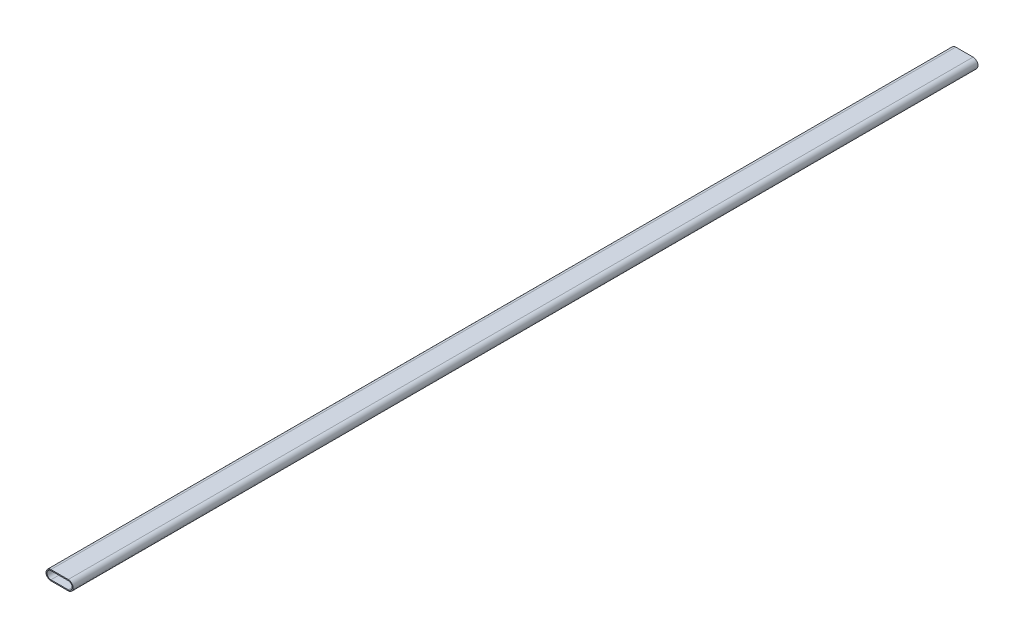
ISO-10303-21;
HEADER;
FILE_DESCRIPTION(('STEP AP214'),'2;1');
FILE_NAME('part.step','',(''),(''),'','','');
FILE_SCHEMA(('AUTOMOTIVE_DESIGN { 1 0 10303 214 1 1 1 1 }'));
ENDSEC;
DATA;
#1=APPLICATION_CONTEXT('core data for automotive mechanical design processes');
#2=APPLICATION_PROTOCOL_DEFINITION('international standard','automotive_design',2000,#1);
#3=PRODUCT_CONTEXT('',#1,'mechanical');
#4=PRODUCT('Part','Part','',(#3));
#5=PRODUCT_RELATED_PRODUCT_CATEGORY('part','',(#4));
#6=PRODUCT_DEFINITION_FORMATION('','',#4);
#7=PRODUCT_DEFINITION_CONTEXT('part definition',#1,'design');
#8=PRODUCT_DEFINITION('design','',#6,#7);
#9=PRODUCT_DEFINITION_SHAPE('','',#8);
#10=(LENGTH_UNIT() NAMED_UNIT(*) SI_UNIT(.MILLI.,.METRE.));
#11=(NAMED_UNIT(*) PLANE_ANGLE_UNIT() SI_UNIT($,.RADIAN.));
#12=(NAMED_UNIT(*) SI_UNIT($,.STERADIAN.) SOLID_ANGLE_UNIT());
#13=UNCERTAINTY_MEASURE_WITH_UNIT(LENGTH_MEASURE(1.E-05),#10,'distance_accuracy_value','');
#14=(GEOMETRIC_REPRESENTATION_CONTEXT(3) GLOBAL_UNCERTAINTY_ASSIGNED_CONTEXT((#13)) GLOBAL_UNIT_ASSIGNED_CONTEXT((#10,
#11,#12)) REPRESENTATION_CONTEXT('',''));
#15=CARTESIAN_POINT('',(0.,0.,0.));
#16=DIRECTION('',(0.,0.,1.));
#17=DIRECTION('',(1.,0.,0.));
#18=AXIS2_PLACEMENT_3D('',#15,#16,#17);
#19=CARTESIAN_POINT('',(0.,0.,1100.));
#20=DIRECTION('',(0.,0.,1.));
#21=DIRECTION('',(1.,0.,0.));
#22=AXIS2_PLACEMENT_3D('',#19,#20,#21);
#23=PLANE('',#22);
#24=CARTESIAN_POINT('',(0.,0.,1100.));
#25=DIRECTION('',(0.,0.,1.));
#26=DIRECTION('',(1.,0.,0.));
#27=AXIS2_PLACEMENT_3D('',#24,#25,#26);
#28=CIRCLE('',#27,6.);
#29=CARTESIAN_POINT('',(0.,6.,1100.));
#30=VERTEX_POINT('',#29);
#31=CARTESIAN_POINT('',(0.,-6.,1100.));
#32=VERTEX_POINT('',#31);
#33=EDGE_CURVE('E133',#30,#32,#28,.T.);
#34=ORIENTED_EDGE('',*,*,#33,.T.);
#35=DIRECTION('',(1.,0.,0.));
#36=VECTOR('',#35,1.);
#37=CARTESIAN_POINT('',(0.,-6.,1100.));
#38=LINE('',#37,#36);
#39=CARTESIAN_POINT('',(21.,-6.,1100.));
#40=VERTEX_POINT('',#39);
#41=EDGE_CURVE('E136',#32,#40,#38,.T.);
#42=ORIENTED_EDGE('',*,*,#41,.T.);
#43=CARTESIAN_POINT('',(21.,0.,1100.));
#44=DIRECTION('',(0.,0.,1.));
#45=DIRECTION('',(1.,0.,0.));
#46=AXIS2_PLACEMENT_3D('',#43,#44,#45);
#47=CIRCLE('',#46,6.);
#48=CARTESIAN_POINT('',(21.,6.,1100.));
#49=VERTEX_POINT('',#48);
#50=EDGE_CURVE('E139',#40,#49,#47,.T.);
#51=ORIENTED_EDGE('',*,*,#50,.T.);
#52=DIRECTION('',(-1.,0.,0.));
#53=VECTOR('',#52,1.);
#54=CARTESIAN_POINT('',(0.,6.,1100.));
#55=LINE('',#54,#53);
#56=EDGE_CURVE('E141',#49,#30,#55,.T.);
#57=ORIENTED_EDGE('',*,*,#56,.T.);
#58=EDGE_LOOP('',(#34,#42,#51,#57));
#59=FACE_BOUND('',#58,.T.);
#60=DIRECTION('',(1.,0.,0.));
#61=VECTOR('',#60,1.);
#62=CARTESIAN_POINT('',(0.,-4.8,1100.));
#63=LINE('',#62,#61);
#64=CARTESIAN_POINT('',(0.,-4.8,1100.));
#65=VERTEX_POINT('',#64);
#66=CARTESIAN_POINT('',(21.,-4.8,1100.));
#67=VERTEX_POINT('',#66);
#68=EDGE_CURVE('E105',#65,#67,#63,.T.);
#69=ORIENTED_EDGE('',*,*,#68,.F.);
#70=CARTESIAN_POINT('',(0.,0.,1100.));
#71=DIRECTION('',(0.,0.,1.));
#72=DIRECTION('',(1.,0.,0.));
#73=AXIS2_PLACEMENT_3D('',#70,#71,#72);
#74=CIRCLE('',#73,4.8);
#75=CARTESIAN_POINT('',(0.,4.8,1100.));
#76=VERTEX_POINT('',#75);
#77=EDGE_CURVE('E97',#76,#65,#74,.T.);
#78=ORIENTED_EDGE('',*,*,#77,.F.);
#79=DIRECTION('',(-1.,0.,0.));
#80=VECTOR('',#79,1.);
#81=CARTESIAN_POINT('',(0.,4.8,1100.));
#82=LINE('',#81,#80);
#83=CARTESIAN_POINT('',(21.,4.8,1100.));
#84=VERTEX_POINT('',#83);
#85=EDGE_CURVE('E119',#84,#76,#82,.T.);
#86=ORIENTED_EDGE('',*,*,#85,.F.);
#87=CARTESIAN_POINT('',(21.,0.,1100.));
#88=DIRECTION('',(0.,0.,1.));
#89=DIRECTION('',(1.,0.,0.));
#90=AXIS2_PLACEMENT_3D('',#87,#88,#89);
#91=CIRCLE('',#90,4.8);
#92=EDGE_CURVE('E117',#67,#84,#91,.T.);
#93=ORIENTED_EDGE('',*,*,#92,.F.);
#94=EDGE_LOOP('',(#69,#78,#86,#93));
#95=FACE_BOUND('',#94,.T.);
#96=ADVANCED_FACE('F32',(#59,#95),#23,.T.);
#97=CARTESIAN_POINT('',(0.,0.,0.));
#98=DIRECTION('',(0.,0.,1.));
#99=DIRECTION('',(1.,0.,0.));
#100=AXIS2_PLACEMENT_3D('',#97,#98,#99);
#101=PLANE('',#100);
#102=CARTESIAN_POINT('',(0.,0.,0.));
#103=DIRECTION('',(0.,0.,1.));
#104=DIRECTION('',(1.,0.,0.));
#105=AXIS2_PLACEMENT_3D('',#102,#103,#104);
#106=CIRCLE('',#105,6.);
#107=CARTESIAN_POINT('',(0.,6.,0.));
#108=VERTEX_POINT('',#107);
#109=CARTESIAN_POINT('',(0.,-6.,0.));
#110=VERTEX_POINT('',#109);
#111=EDGE_CURVE('E113',#108,#110,#106,.T.);
#112=ORIENTED_EDGE('',*,*,#111,.F.);
#113=DIRECTION('',(-1.,0.,0.));
#114=VECTOR('',#113,1.);
#115=CARTESIAN_POINT('',(0.,6.,0.));
#116=LINE('',#115,#114);
#117=CARTESIAN_POINT('',(21.,6.,0.));
#118=VERTEX_POINT('',#117);
#119=EDGE_CURVE('E137',#118,#108,#116,.T.);
#120=ORIENTED_EDGE('',*,*,#119,.F.);
#121=CARTESIAN_POINT('',(21.,0.,0.));
#122=DIRECTION('',(0.,0.,1.));
#123=DIRECTION('',(1.,0.,0.));
#124=AXIS2_PLACEMENT_3D('',#121,#122,#123);
#125=CIRCLE('',#124,6.);
#126=CARTESIAN_POINT('',(21.,-6.,0.));
#127=VERTEX_POINT('',#126);
#128=EDGE_CURVE('E148',#127,#118,#125,.T.);
#129=ORIENTED_EDGE('',*,*,#128,.F.);
#130=DIRECTION('',(1.,0.,0.));
#131=VECTOR('',#130,1.);
#132=CARTESIAN_POINT('',(0.,-6.,0.));
#133=LINE('',#132,#131);
#134=EDGE_CURVE('E146',#110,#127,#133,.T.);
#135=ORIENTED_EDGE('',*,*,#134,.F.);
#136=EDGE_LOOP('',(#112,#120,#129,#135));
#137=FACE_BOUND('',#136,.T.);
#138=CARTESIAN_POINT('',(0.,0.,0.));
#139=DIRECTION('',(0.,0.,1.));
#140=DIRECTION('',(1.,0.,0.));
#141=AXIS2_PLACEMENT_3D('',#138,#139,#140);
#142=CIRCLE('',#141,4.8);
#143=CARTESIAN_POINT('',(0.,4.8,0.));
#144=VERTEX_POINT('',#143);
#145=CARTESIAN_POINT('',(0.,-4.8,0.));
#146=VERTEX_POINT('',#145);
#147=EDGE_CURVE('E55',#144,#146,#142,.T.);
#148=ORIENTED_EDGE('',*,*,#147,.T.);
#149=DIRECTION('',(1.,0.,0.));
#150=VECTOR('',#149,1.);
#151=CARTESIAN_POINT('',(0.,-4.8,0.));
#152=LINE('',#151,#150);
#153=CARTESIAN_POINT('',(21.,-4.8,0.));
#154=VERTEX_POINT('',#153);
#155=EDGE_CURVE('E112',#146,#154,#152,.T.);
#156=ORIENTED_EDGE('',*,*,#155,.T.);
#157=CARTESIAN_POINT('',(21.,0.,0.));
#158=DIRECTION('',(0.,0.,1.));
#159=DIRECTION('',(1.,0.,0.));
#160=AXIS2_PLACEMENT_3D('',#157,#158,#159);
#161=CIRCLE('',#160,4.8);
#162=CARTESIAN_POINT('',(21.,4.8,0.));
#163=VERTEX_POINT('',#162);
#164=EDGE_CURVE('E125',#154,#163,#161,.T.);
#165=ORIENTED_EDGE('',*,*,#164,.T.);
#166=DIRECTION('',(-1.,0.,0.));
#167=VECTOR('',#166,1.);
#168=CARTESIAN_POINT('',(0.,4.8,0.));
#169=LINE('',#168,#167);
#170=EDGE_CURVE('E106',#163,#144,#169,.T.);
#171=ORIENTED_EDGE('',*,*,#170,.T.);
#172=EDGE_LOOP('',(#148,#156,#165,#171));
#173=FACE_BOUND('',#172,.T.);
#174=ADVANCED_FACE('F166',(#137,#173),#101,.F.);
#175=CARTESIAN_POINT('',(0.,0.,1100.));
#176=DIRECTION('',(0.,0.,-1.));
#177=DIRECTION('',(-1.,0.,0.));
#178=AXIS2_PLACEMENT_3D('',#175,#176,#177);
#179=CYLINDRICAL_SURFACE('',#178,6.);
#180=ORIENTED_EDGE('',*,*,#111,.T.);
#181=DIRECTION('',(0.,0.,-1.));
#182=VECTOR('',#181,1.);
#183=CARTESIAN_POINT('',(0.,-6.,1100.));
#184=LINE('',#183,#182);
#185=EDGE_CURVE('E11',#32,#110,#184,.T.);
#186=ORIENTED_EDGE('',*,*,#185,.F.);
#187=ORIENTED_EDGE('',*,*,#33,.F.);
#188=DIRECTION('',(0.,0.,-1.));
#189=VECTOR('',#188,1.);
#190=CARTESIAN_POINT('',(0.,6.,1100.));
#191=LINE('',#190,#189);
#192=EDGE_CURVE('E143',#30,#108,#191,.T.);
#193=ORIENTED_EDGE('',*,*,#192,.T.);
#194=EDGE_LOOP('',(#180,#186,#187,#193));
#195=FACE_BOUND('',#194,.T.);
#196=ADVANCED_FACE('F34',(#195),#179,.T.);
#197=CARTESIAN_POINT('',(0.,-6.,1100.));
#198=DIRECTION('',(0.,1.,0.));
#199=DIRECTION('',(0.,0.,1.));
#200=AXIS2_PLACEMENT_3D('',#197,#198,#199);
#201=PLANE('',#200);
#202=ORIENTED_EDGE('',*,*,#134,.T.);
#203=DIRECTION('',(0.,0.,-1.));
#204=VECTOR('',#203,1.);
#205=CARTESIAN_POINT('',(21.,-6.,1100.));
#206=LINE('',#205,#204);
#207=EDGE_CURVE('E40',#40,#127,#206,.T.);
#208=ORIENTED_EDGE('',*,*,#207,.F.);
#209=ORIENTED_EDGE('',*,*,#41,.F.);
#210=ORIENTED_EDGE('',*,*,#185,.T.);
#211=EDGE_LOOP('',(#202,#208,#209,#210));
#212=FACE_BOUND('',#211,.T.);
#213=ADVANCED_FACE('F176',(#212),#201,.F.);
#214=CARTESIAN_POINT('',(21.,0.,1100.));
#215=DIRECTION('',(0.,0.,-1.));
#216=DIRECTION('',(-1.,0.,0.));
#217=AXIS2_PLACEMENT_3D('',#214,#215,#216);
#218=CYLINDRICAL_SURFACE('',#217,6.);
#219=ORIENTED_EDGE('',*,*,#128,.T.);
#220=DIRECTION('',(0.,0.,-1.));
#221=VECTOR('',#220,1.);
#222=CARTESIAN_POINT('',(21.,6.,1100.));
#223=LINE('',#222,#221);
#224=EDGE_CURVE('E153',#49,#118,#223,.T.);
#225=ORIENTED_EDGE('',*,*,#224,.F.);
#226=ORIENTED_EDGE('',*,*,#50,.F.);
#227=ORIENTED_EDGE('',*,*,#207,.T.);
#228=EDGE_LOOP('',(#219,#225,#226,#227));
#229=FACE_BOUND('',#228,.T.);
#230=ADVANCED_FACE('F160',(#229),#218,.T.);
#231=CARTESIAN_POINT('',(0.,6.,1100.));
#232=DIRECTION('',(0.,-1.,0.));
#233=DIRECTION('',(0.,0.,-1.));
#234=AXIS2_PLACEMENT_3D('',#231,#232,#233);
#235=PLANE('',#234);
#236=ORIENTED_EDGE('',*,*,#119,.T.);
#237=ORIENTED_EDGE('',*,*,#192,.F.);
#238=ORIENTED_EDGE('',*,*,#56,.F.);
#239=ORIENTED_EDGE('',*,*,#224,.T.);
#240=EDGE_LOOP('',(#236,#237,#238,#239));
#241=FACE_BOUND('',#240,.T.);
#242=ADVANCED_FACE('F170',(#241),#235,.F.);
#243=CARTESIAN_POINT('',(0.,0.,1100.));
#244=DIRECTION('',(0.,0.,-1.));
#245=DIRECTION('',(-1.,0.,0.));
#246=AXIS2_PLACEMENT_3D('',#243,#244,#245);
#247=CYLINDRICAL_SURFACE('',#246,4.8);
#248=ORIENTED_EDGE('',*,*,#147,.F.);
#249=DIRECTION('',(0.,0.,-1.));
#250=VECTOR('',#249,1.);
#251=CARTESIAN_POINT('',(0.,4.8,1100.));
#252=LINE('',#251,#250);
#253=EDGE_CURVE('E101',#76,#144,#252,.T.);
#254=ORIENTED_EDGE('',*,*,#253,.F.);
#255=ORIENTED_EDGE('',*,*,#77,.T.);
#256=DIRECTION('',(0.,0.,-1.));
#257=VECTOR('',#256,1.);
#258=CARTESIAN_POINT('',(0.,-4.8,1100.));
#259=LINE('',#258,#257);
#260=EDGE_CURVE('E100',#65,#146,#259,.T.);
#261=ORIENTED_EDGE('',*,*,#260,.T.);
#262=EDGE_LOOP('',(#248,#254,#255,#261));
#263=FACE_BOUND('',#262,.T.);
#264=ADVANCED_FACE('F99',(#263),#247,.F.);
#265=CARTESIAN_POINT('',(0.,-4.8,1100.));
#266=DIRECTION('',(0.,1.,0.));
#267=DIRECTION('',(0.,0.,1.));
#268=AXIS2_PLACEMENT_3D('',#265,#266,#267);
#269=PLANE('',#268);
#270=ORIENTED_EDGE('',*,*,#155,.F.);
#271=ORIENTED_EDGE('',*,*,#260,.F.);
#272=ORIENTED_EDGE('',*,*,#68,.T.);
#273=DIRECTION('',(0.,0.,-1.));
#274=VECTOR('',#273,1.);
#275=CARTESIAN_POINT('',(21.,-4.8,1100.));
#276=LINE('',#275,#274);
#277=EDGE_CURVE('E114',#67,#154,#276,.T.);
#278=ORIENTED_EDGE('',*,*,#277,.T.);
#279=EDGE_LOOP('',(#270,#271,#272,#278));
#280=FACE_BOUND('',#279,.T.);
#281=ADVANCED_FACE('F109',(#280),#269,.T.);
#282=CARTESIAN_POINT('',(21.,0.,1100.));
#283=DIRECTION('',(0.,0.,-1.));
#284=DIRECTION('',(-1.,0.,0.));
#285=AXIS2_PLACEMENT_3D('',#282,#283,#284);
#286=CYLINDRICAL_SURFACE('',#285,4.8);
#287=ORIENTED_EDGE('',*,*,#164,.F.);
#288=ORIENTED_EDGE('',*,*,#277,.F.);
#289=ORIENTED_EDGE('',*,*,#92,.T.);
#290=DIRECTION('',(0.,0.,-1.));
#291=VECTOR('',#290,1.);
#292=CARTESIAN_POINT('',(21.,4.8,1100.));
#293=LINE('',#292,#291);
#294=EDGE_CURVE('E47',#84,#163,#293,.T.);
#295=ORIENTED_EDGE('',*,*,#294,.T.);
#296=EDGE_LOOP('',(#287,#288,#289,#295));
#297=FACE_BOUND('',#296,.T.);
#298=ADVANCED_FACE('F199',(#297),#286,.F.);
#299=CARTESIAN_POINT('',(0.,4.8,1100.));
#300=DIRECTION('',(0.,-1.,0.));
#301=DIRECTION('',(0.,0.,-1.));
#302=AXIS2_PLACEMENT_3D('',#299,#300,#301);
#303=PLANE('',#302);
#304=ORIENTED_EDGE('',*,*,#170,.F.);
#305=ORIENTED_EDGE('',*,*,#294,.F.);
#306=ORIENTED_EDGE('',*,*,#85,.T.);
#307=ORIENTED_EDGE('',*,*,#253,.T.);
#308=EDGE_LOOP('',(#304,#305,#306,#307));
#309=FACE_BOUND('',#308,.T.);
#310=ADVANCED_FACE('F203',(#309),#303,.T.);
#311=CLOSED_SHELL('',(#96,#174,#196,#213,#230,#242,#264,#281,#298,#310));
#312=MANIFOLD_SOLID_BREP('B2',#311);
#313=ADVANCED_BREP_SHAPE_REPRESENTATION('',(#18,#312),#14);
#314=SHAPE_DEFINITION_REPRESENTATION(#9,#313);
ENDSEC;
END-ISO-10303-21;
